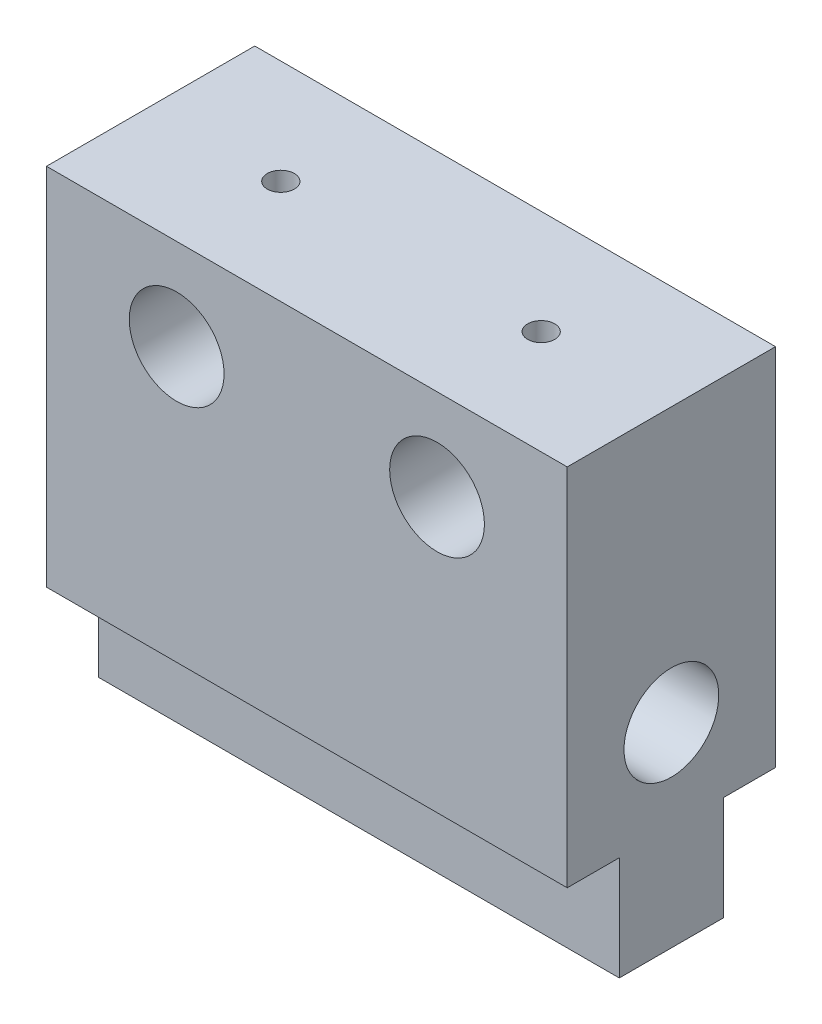
ISO-10303-21;
HEADER;
FILE_DESCRIPTION(('STEP AP214'),'2;1');
FILE_NAME('part.step','',(''),(''),'','','');
FILE_SCHEMA(('AUTOMOTIVE_DESIGN { 1 0 10303 214 1 1 1 1 }'));
ENDSEC;
DATA;
#1=APPLICATION_CONTEXT('core data for automotive mechanical design processes');
#2=APPLICATION_PROTOCOL_DEFINITION('international standard','automotive_design',2000,#1);
#3=PRODUCT_CONTEXT('',#1,'mechanical');
#4=PRODUCT('Part','Part','',(#3));
#5=PRODUCT_RELATED_PRODUCT_CATEGORY('part','',(#4));
#6=PRODUCT_DEFINITION_FORMATION('','',#4);
#7=PRODUCT_DEFINITION_CONTEXT('part definition',#1,'design');
#8=PRODUCT_DEFINITION('design','',#6,#7);
#9=PRODUCT_DEFINITION_SHAPE('','',#8);
#10=(LENGTH_UNIT() NAMED_UNIT(*) SI_UNIT(.MILLI.,.METRE.));
#11=(NAMED_UNIT(*) PLANE_ANGLE_UNIT() SI_UNIT($,.RADIAN.));
#12=(NAMED_UNIT(*) SI_UNIT($,.STERADIAN.) SOLID_ANGLE_UNIT());
#13=UNCERTAINTY_MEASURE_WITH_UNIT(LENGTH_MEASURE(1.E-05),#10,'distance_accuracy_value','');
#14=(GEOMETRIC_REPRESENTATION_CONTEXT(3) GLOBAL_UNCERTAINTY_ASSIGNED_CONTEXT((#13)) GLOBAL_UNIT_ASSIGNED_CONTEXT((#10,
#11,#12)) REPRESENTATION_CONTEXT('',''));
#15=CARTESIAN_POINT('',(0.,0.,0.));
#16=DIRECTION('',(0.,0.,1.));
#17=DIRECTION('',(1.,0.,0.));
#18=AXIS2_PLACEMENT_3D('',#15,#16,#17);
#19=CARTESIAN_POINT('',(-50.,-35.,20.));
#20=DIRECTION('',(0.,1.,0.));
#21=DIRECTION('',(0.,0.,1.));
#22=AXIS2_PLACEMENT_3D('',#19,#20,#21);
#23=PLANE('',#22);
#24=DIRECTION('',(1.,0.,0.));
#25=VECTOR('',#24,1.);
#26=CARTESIAN_POINT('',(-50.,-35.,-10.));
#27=LINE('',#26,#25);
#28=CARTESIAN_POINT('',(-50.,-35.,-10.));
#29=VERTEX_POINT('',#28);
#30=CARTESIAN_POINT('',(50.,-35.,-10.));
#31=VERTEX_POINT('',#30);
#32=EDGE_CURVE('E66',#29,#31,#27,.T.);
#33=ORIENTED_EDGE('',*,*,#32,.F.);
#34=DIRECTION('',(0.,0.,-1.));
#35=VECTOR('',#34,1.);
#36=CARTESIAN_POINT('',(-50.,-35.,20.));
#37=LINE('',#36,#35);
#38=CARTESIAN_POINT('',(-50.,-35.,-20.));
#39=VERTEX_POINT('',#38);
#40=EDGE_CURVE('E210',#29,#39,#37,.T.);
#41=ORIENTED_EDGE('',*,*,#40,.T.);
#42=DIRECTION('',(1.,0.,0.));
#43=VECTOR('',#42,1.);
#44=CARTESIAN_POINT('',(-50.,-35.,-20.));
#45=LINE('',#44,#43);
#46=CARTESIAN_POINT('',(50.,-35.,-20.));
#47=VERTEX_POINT('',#46);
#48=EDGE_CURVE('E188',#39,#47,#45,.T.);
#49=ORIENTED_EDGE('',*,*,#48,.T.);
#50=DIRECTION('',(0.,0.,-1.));
#51=VECTOR('',#50,1.);
#52=CARTESIAN_POINT('',(50.,-35.,20.));
#53=LINE('',#52,#51);
#54=EDGE_CURVE('E71',#31,#47,#53,.T.);
#55=ORIENTED_EDGE('',*,*,#54,.F.);
#56=EDGE_LOOP('',(#33,#41,#49,#55));
#57=FACE_BOUND('',#56,.T.);
#58=ADVANCED_FACE('F43',(#57),#23,.F.);
#59=DIRECTION('',(-1.,0.,0.));
#60=VECTOR('',#59,1.);
#61=CARTESIAN_POINT('',(-50.,-35.,10.));
#62=LINE('',#61,#60);
#63=CARTESIAN_POINT('',(50.,-35.,10.));
#64=VERTEX_POINT('',#63);
#65=CARTESIAN_POINT('',(-50.,-35.,10.));
#66=VERTEX_POINT('',#65);
#67=EDGE_CURVE('E437',#64,#66,#62,.T.);
#68=ORIENTED_EDGE('',*,*,#67,.F.);
#69=CARTESIAN_POINT('',(50.,-35.,20.));
#70=VERTEX_POINT('',#69);
#71=EDGE_CURVE('E141',#70,#64,#53,.T.);
#72=ORIENTED_EDGE('',*,*,#71,.F.);
#73=DIRECTION('',(1.,0.,0.));
#74=VECTOR('',#73,1.);
#75=CARTESIAN_POINT('',(-50.,-35.,20.));
#76=LINE('',#75,#74);
#77=CARTESIAN_POINT('',(-50.,-35.,20.));
#78=VERTEX_POINT('',#77);
#79=EDGE_CURVE('E194',#78,#70,#76,.T.);
#80=ORIENTED_EDGE('',*,*,#79,.F.);
#81=EDGE_CURVE('E211',#78,#66,#37,.T.);
#82=ORIENTED_EDGE('',*,*,#81,.T.);
#83=EDGE_LOOP('',(#68,#72,#80,#82));
#84=FACE_BOUND('',#83,.T.);
#85=ADVANCED_FACE('F245',(#84),#23,.F.);
#86=CARTESIAN_POINT('',(50.,-35.,20.));
#87=DIRECTION('',(-1.,0.,0.));
#88=DIRECTION('',(0.,0.,1.));
#89=AXIS2_PLACEMENT_3D('',#86,#87,#88);
#90=PLANE('',#89);
#91=CARTESIAN_POINT('',(50.,-17.5,0.));
#92=DIRECTION('',(-1.,0.,0.));
#93=DIRECTION('',(0.,0.,1.));
#94=AXIS2_PLACEMENT_3D('',#91,#92,#93);
#95=CIRCLE('',#94,9.1);
#96=CARTESIAN_POINT('',(50.,-17.5,9.1));
#97=VERTEX_POINT('',#96);
#98=EDGE_CURVE('E158',#97,#97,#95,.T.);
#99=ORIENTED_EDGE('',*,*,#98,.T.);
#100=EDGE_LOOP('',(#99));
#101=FACE_BOUND('',#100,.T.);
#102=DIRECTION('',(0.,1.,0.));
#103=VECTOR('',#102,1.);
#104=CARTESIAN_POINT('',(50.,-35.,-20.));
#105=LINE('',#104,#103);
#106=CARTESIAN_POINT('',(50.,35.,-20.));
#107=VERTEX_POINT('',#106);
#108=EDGE_CURVE('E182',#47,#107,#105,.T.);
#109=ORIENTED_EDGE('',*,*,#108,.T.);
#110=DIRECTION('',(0.,0.,-1.));
#111=VECTOR('',#110,1.);
#112=CARTESIAN_POINT('',(50.,35.,20.));
#113=LINE('',#112,#111);
#114=CARTESIAN_POINT('',(50.,35.,20.));
#115=VERTEX_POINT('',#114);
#116=EDGE_CURVE('E11',#115,#107,#113,.T.);
#117=ORIENTED_EDGE('',*,*,#116,.F.);
#118=DIRECTION('',(0.,1.,0.));
#119=VECTOR('',#118,1.);
#120=CARTESIAN_POINT('',(50.,-35.,20.));
#121=LINE('',#120,#119);
#122=EDGE_CURVE('E183',#70,#115,#121,.T.);
#123=ORIENTED_EDGE('',*,*,#122,.F.);
#124=ORIENTED_EDGE('',*,*,#71,.T.);
#125=DIRECTION('',(0.,1.,0.));
#126=VECTOR('',#125,1.);
#127=CARTESIAN_POINT('',(50.,-55.,10.));
#128=LINE('',#127,#126);
#129=CARTESIAN_POINT('',(50.,-55.,10.));
#130=VERTEX_POINT('',#129);
#131=EDGE_CURVE('E119',#130,#64,#128,.T.);
#132=ORIENTED_EDGE('',*,*,#131,.F.);
#133=DIRECTION('',(0.,0.,1.));
#134=VECTOR('',#133,1.);
#135=CARTESIAN_POINT('',(50.,-55.,-10.));
#136=LINE('',#135,#134);
#137=CARTESIAN_POINT('',(50.,-55.,-10.));
#138=VERTEX_POINT('',#137);
#139=EDGE_CURVE('E126',#138,#130,#136,.T.);
#140=ORIENTED_EDGE('',*,*,#139,.F.);
#141=DIRECTION('',(0.,1.,0.));
#142=VECTOR('',#141,1.);
#143=CARTESIAN_POINT('',(50.,-55.,-10.));
#144=LINE('',#143,#142);
#145=EDGE_CURVE('E428',#138,#31,#144,.T.);
#146=ORIENTED_EDGE('',*,*,#145,.T.);
#147=ORIENTED_EDGE('',*,*,#54,.T.);
#148=EDGE_LOOP('',(#109,#117,#123,#124,#132,#140,#146,#147));
#149=FACE_BOUND('',#148,.T.);
#150=ADVANCED_FACE('F45',(#101,#149),#90,.F.);
#151=CARTESIAN_POINT('',(-50.,35.,20.));
#152=DIRECTION('',(0.,-1.,0.));
#153=DIRECTION('',(0.,0.,-1.));
#154=AXIS2_PLACEMENT_3D('',#151,#152,#153);
#155=PLANE('',#154);
#156=CARTESIAN_POINT('',(-25.,35.,0.));
#157=DIRECTION('',(0.,1.,0.));
#158=DIRECTION('',(0.,0.,1.));
#159=AXIS2_PLACEMENT_3D('',#156,#157,#158);
#160=CIRCLE('',#159,2.6);
#161=CARTESIAN_POINT('',(-25.,35.,2.6));
#162=VERTEX_POINT('',#161);
#163=EDGE_CURVE('E148',#162,#162,#160,.T.);
#164=ORIENTED_EDGE('',*,*,#163,.F.);
#165=EDGE_LOOP('',(#164));
#166=FACE_BOUND('',#165,.T.);
#167=CARTESIAN_POINT('',(25.,35.,0.));
#168=DIRECTION('',(0.,1.,0.));
#169=DIRECTION('',(0.,0.,1.));
#170=AXIS2_PLACEMENT_3D('',#167,#168,#169);
#171=CIRCLE('',#170,2.6);
#172=CARTESIAN_POINT('',(25.,35.,2.6));
#173=VERTEX_POINT('',#172);
#174=EDGE_CURVE('E143',#173,#173,#171,.T.);
#175=ORIENTED_EDGE('',*,*,#174,.F.);
#176=EDGE_LOOP('',(#175));
#177=FACE_BOUND('',#176,.T.);
#178=DIRECTION('',(-1.,0.,0.));
#179=VECTOR('',#178,1.);
#180=CARTESIAN_POINT('',(-50.,35.,-20.));
#181=LINE('',#180,#179);
#182=CARTESIAN_POINT('',(-50.,35.,-20.));
#183=VERTEX_POINT('',#182);
#184=EDGE_CURVE('E199',#107,#183,#181,.T.);
#185=ORIENTED_EDGE('',*,*,#184,.T.);
#186=DIRECTION('',(0.,0.,-1.));
#187=VECTOR('',#186,1.);
#188=CARTESIAN_POINT('',(-50.,35.,20.));
#189=LINE('',#188,#187);
#190=CARTESIAN_POINT('',(-50.,35.,20.));
#191=VERTEX_POINT('',#190);
#192=EDGE_CURVE('E58',#191,#183,#189,.T.);
#193=ORIENTED_EDGE('',*,*,#192,.F.);
#194=DIRECTION('',(-1.,0.,0.));
#195=VECTOR('',#194,1.);
#196=CARTESIAN_POINT('',(-50.,35.,20.));
#197=LINE('',#196,#195);
#198=EDGE_CURVE('E187',#115,#191,#197,.T.);
#199=ORIENTED_EDGE('',*,*,#198,.F.);
#200=ORIENTED_EDGE('',*,*,#116,.T.);
#201=EDGE_LOOP('',(#185,#193,#199,#200));
#202=FACE_BOUND('',#201,.T.);
#203=ADVANCED_FACE('F259',(#166,#177,#202),#155,.F.);
#204=CARTESIAN_POINT('',(-50.,-35.,20.));
#205=DIRECTION('',(1.,0.,0.));
#206=DIRECTION('',(0.,0.,-1.));
#207=AXIS2_PLACEMENT_3D('',#204,#205,#206);
#208=PLANE('',#207);
#209=CARTESIAN_POINT('',(-50.,-17.5,0.));
#210=DIRECTION('',(-1.,0.,0.));
#211=DIRECTION('',(0.,0.,1.));
#212=AXIS2_PLACEMENT_3D('',#209,#210,#211);
#213=CIRCLE('',#212,9.1);
#214=CARTESIAN_POINT('',(-50.,-17.5,9.1));
#215=VERTEX_POINT('',#214);
#216=EDGE_CURVE('E163',#215,#215,#213,.T.);
#217=ORIENTED_EDGE('',*,*,#216,.F.);
#218=EDGE_LOOP('',(#217));
#219=FACE_BOUND('',#218,.T.);
#220=DIRECTION('',(0.,-1.,0.));
#221=VECTOR('',#220,1.);
#222=CARTESIAN_POINT('',(-50.,-35.,-20.));
#223=LINE('',#222,#221);
#224=EDGE_CURVE('E202',#183,#39,#223,.T.);
#225=ORIENTED_EDGE('',*,*,#224,.T.);
#226=ORIENTED_EDGE('',*,*,#40,.F.);
#227=DIRECTION('',(0.,1.,0.));
#228=VECTOR('',#227,1.);
#229=CARTESIAN_POINT('',(-50.,-55.,-10.));
#230=LINE('',#229,#228);
#231=CARTESIAN_POINT('',(-50.,-55.,-10.));
#232=VERTEX_POINT('',#231);
#233=EDGE_CURVE('E150',#232,#29,#230,.T.);
#234=ORIENTED_EDGE('',*,*,#233,.F.);
#235=DIRECTION('',(0.,0.,-1.));
#236=VECTOR('',#235,1.);
#237=CARTESIAN_POINT('',(-50.,-55.,-10.));
#238=LINE('',#237,#236);
#239=CARTESIAN_POINT('',(-50.,-55.,10.));
#240=VERTEX_POINT('',#239);
#241=EDGE_CURVE('E125',#240,#232,#238,.T.);
#242=ORIENTED_EDGE('',*,*,#241,.F.);
#243=DIRECTION('',(0.,1.,0.));
#244=VECTOR('',#243,1.);
#245=CARTESIAN_POINT('',(-50.,-55.,10.));
#246=LINE('',#245,#244);
#247=EDGE_CURVE('E121',#240,#66,#246,.T.);
#248=ORIENTED_EDGE('',*,*,#247,.T.);
#249=ORIENTED_EDGE('',*,*,#81,.F.);
#250=DIRECTION('',(0.,-1.,0.));
#251=VECTOR('',#250,1.);
#252=CARTESIAN_POINT('',(-50.,-35.,20.));
#253=LINE('',#252,#251);
#254=EDGE_CURVE('E191',#191,#78,#253,.T.);
#255=ORIENTED_EDGE('',*,*,#254,.F.);
#256=ORIENTED_EDGE('',*,*,#192,.T.);
#257=EDGE_LOOP('',(#225,#226,#234,#242,#248,#249,#255,#256));
#258=FACE_BOUND('',#257,.T.);
#259=ADVANCED_FACE('F256',(#219,#258),#208,.F.);
#260=CARTESIAN_POINT('',(0.,0.,20.));
#261=DIRECTION('',(0.,0.,-1.));
#262=DIRECTION('',(-1.,0.,0.));
#263=AXIS2_PLACEMENT_3D('',#260,#261,#262);
#264=PLANE('',#263);
#265=CARTESIAN_POINT('',(25.,17.5,20.));
#266=DIRECTION('',(0.,0.,-1.));
#267=DIRECTION('',(-1.,0.,0.));
#268=AXIS2_PLACEMENT_3D('',#265,#266,#267);
#269=CIRCLE('',#268,9.1);
#270=CARTESIAN_POINT('',(15.9,17.5,20.));
#271=VERTEX_POINT('',#270);
#272=EDGE_CURVE('E178',#271,#271,#269,.T.);
#273=ORIENTED_EDGE('',*,*,#272,.T.);
#274=EDGE_LOOP('',(#273));
#275=FACE_BOUND('',#274,.T.);
#276=CARTESIAN_POINT('',(-25.,17.5,20.));
#277=DIRECTION('',(0.,0.,-1.));
#278=DIRECTION('',(-1.,0.,0.));
#279=AXIS2_PLACEMENT_3D('',#276,#277,#278);
#280=CIRCLE('',#279,9.1);
#281=CARTESIAN_POINT('',(-34.1,17.5,20.));
#282=VERTEX_POINT('',#281);
#283=EDGE_CURVE('E171',#282,#282,#280,.T.);
#284=ORIENTED_EDGE('',*,*,#283,.T.);
#285=EDGE_LOOP('',(#284));
#286=FACE_BOUND('',#285,.T.);
#287=ORIENTED_EDGE('',*,*,#122,.T.);
#288=ORIENTED_EDGE('',*,*,#198,.T.);
#289=ORIENTED_EDGE('',*,*,#254,.T.);
#290=ORIENTED_EDGE('',*,*,#79,.T.);
#291=EDGE_LOOP('',(#287,#288,#289,#290));
#292=FACE_BOUND('',#291,.T.);
#293=ADVANCED_FACE('F258',(#275,#286,#292),#264,.F.);
#294=CARTESIAN_POINT('',(0.,0.,-20.));
#295=DIRECTION('',(0.,0.,-1.));
#296=DIRECTION('',(-1.,0.,0.));
#297=AXIS2_PLACEMENT_3D('',#294,#295,#296);
#298=PLANE('',#297);
#299=CARTESIAN_POINT('',(25.,17.5,-20.));
#300=DIRECTION('',(0.,0.,1.));
#301=DIRECTION('',(1.,0.,0.));
#302=AXIS2_PLACEMENT_3D('',#299,#300,#301);
#303=CIRCLE('',#302,9.1);
#304=CARTESIAN_POINT('',(34.1,17.5,-20.));
#305=VERTEX_POINT('',#304);
#306=EDGE_CURVE('E167',#305,#305,#303,.T.);
#307=ORIENTED_EDGE('',*,*,#306,.T.);
#308=EDGE_LOOP('',(#307));
#309=FACE_BOUND('',#308,.T.);
#310=CARTESIAN_POINT('',(-25.,17.5,-20.));
#311=DIRECTION('',(0.,0.,1.));
#312=DIRECTION('',(1.,0.,0.));
#313=AXIS2_PLACEMENT_3D('',#310,#311,#312);
#314=CIRCLE('',#313,9.1);
#315=CARTESIAN_POINT('',(-15.9,17.5,-20.));
#316=VERTEX_POINT('',#315);
#317=EDGE_CURVE('E162',#316,#316,#314,.T.);
#318=ORIENTED_EDGE('',*,*,#317,.T.);
#319=EDGE_LOOP('',(#318));
#320=FACE_BOUND('',#319,.T.);
#321=ORIENTED_EDGE('',*,*,#108,.F.);
#322=ORIENTED_EDGE('',*,*,#48,.F.);
#323=ORIENTED_EDGE('',*,*,#224,.F.);
#324=ORIENTED_EDGE('',*,*,#184,.F.);
#325=EDGE_LOOP('',(#321,#322,#323,#324));
#326=FACE_BOUND('',#325,.T.);
#327=ADVANCED_FACE('F254',(#309,#320,#326),#298,.T.);
#328=CARTESIAN_POINT('',(-25.,17.5,-20.));
#329=DIRECTION('',(0.,0.,1.));
#330=DIRECTION('',(1.,0.,0.));
#331=AXIS2_PLACEMENT_3D('',#328,#329,#330);
#332=CYLINDRICAL_SURFACE('',#331,9.1);
#333=CARTESIAN_POINT('',(-25.,26.6,2.6));
#334=CARTESIAN_POINT('',(-24.8570586269096,26.5999983008264,2.59999747856947));
#335=CARTESIAN_POINT('',(-24.7140913277657,26.5965994262266,2.58817287433105));
#336=CARTESIAN_POINT('',(-24.4323004114439,26.5833717772863,2.54128644886699));
#337=CARTESIAN_POINT('',(-24.2934783831215,26.5735405697311,2.50621583410368));
#338=CARTESIAN_POINT('',(-24.0240844090408,26.5485289875379,2.41408955005854));
#339=CARTESIAN_POINT('',(-23.8935012548973,26.5333560733824,2.35706453300247));
#340=CARTESIAN_POINT('',(-23.643750610532,26.4992497181151,2.22276861107814));
#341=CARTESIAN_POINT('',(-23.5245843164684,26.4803158836043,2.14549558796254));
#342=CARTESIAN_POINT('',(-23.2979172190834,26.4401615501325,1.97075448612521));
#343=CARTESIAN_POINT('',(-23.1907591609048,26.4188975452875,1.87285181998815));
#344=CARTESIAN_POINT('',(-22.9941372346984,26.3767475539033,1.66055793392101));
#345=CARTESIAN_POINT('',(-22.9046760197988,26.3558616244715,1.5461642460781));
#346=CARTESIAN_POINT('',(-22.7442427299164,26.31637919338,1.30130834237181));
#347=CARTESIAN_POINT('',(-22.6736783256565,26.2978371325782,1.17056941941568));
#348=CARTESIAN_POINT('',(-22.5556727827983,26.2657874699287,0.898466384724004));
#349=CARTESIAN_POINT('',(-22.5082266697757,26.2522787851833,0.757104566307838));
#350=CARTESIAN_POINT('',(-22.4390203708196,26.2322769065482,0.471594807884798));
#351=CARTESIAN_POINT('',(-22.416632808363,26.2256127214101,0.327611228401811));
#352=CARTESIAN_POINT('',(-22.3962213187406,26.2195447066259,0.0377895070200661));
#353=CARTESIAN_POINT('',(-22.3981920976749,26.220139299399,-0.10804822502529));
#354=CARTESIAN_POINT('',(-22.4259462480823,26.2283694473291,-0.392429194893011));
#355=CARTESIAN_POINT('',(-22.4509557655309,26.2357761750732,-0.531055656534988));
#356=CARTESIAN_POINT('',(-22.5228319808847,26.2564275289765,-0.802057385515875));
#357=CARTESIAN_POINT('',(-22.5697006547438,26.2696726828932,-0.934432086536653));
#358=CARTESIAN_POINT('',(-22.6845611452085,26.300699225709,-1.19112011776136));
#359=CARTESIAN_POINT('',(-22.7528128347526,26.3185359132734,-1.31531019412218));
#360=CARTESIAN_POINT('',(-22.9083210708175,26.3567078194668,-1.55073952957743));
#361=CARTESIAN_POINT('',(-22.9955818482465,26.3770435938849,-1.66197589705539));
#362=CARTESIAN_POINT('',(-23.1905248042507,26.4188612585326,-1.87274408828828));
#363=CARTESIAN_POINT('',(-23.2988526627011,26.4403574594408,-1.9716768187574));
#364=CARTESIAN_POINT('',(-23.5308280328979,26.4813912138385,-2.15010380473237));
#365=CARTESIAN_POINT('',(-23.6544763380736,26.5009286657917,-2.22959705285423));
#366=CARTESIAN_POINT('',(-23.9146000049811,26.5359948648515,-2.36720735520625));
#367=CARTESIAN_POINT('',(-24.051143236847,26.551500581464,-2.42520237284544));
#368=CARTESIAN_POINT('',(-24.3325888010423,26.5765902693386,-2.51723405884187));
#369=CARTESIAN_POINT('',(-24.4774890164468,26.5861757331313,-2.55127676601885));
#370=CARTESIAN_POINT('',(-24.7664336947624,26.5981133686907,-2.59346527142229));
#371=CARTESIAN_POINT('',(-24.9103502490814,26.6006925470578,-2.60242410398493));
#372=CARTESIAN_POINT('',(-25.1976344848473,26.5989871011922,-2.59645455380865));
#373=CARTESIAN_POINT('',(-25.3410022300842,26.5947033005482,-2.5815290373003));
#374=CARTESIAN_POINT('',(-25.6201242234594,26.5799010469077,-2.52887642238887));
#375=CARTESIAN_POINT('',(-25.7559736752553,26.5695099692298,-2.49161486427959));
#376=CARTESIAN_POINT('',(-26.0194712920673,26.5436839836445,-2.39589934741992));
#377=CARTESIAN_POINT('',(-26.1471185066233,26.5282484924565,-2.33744293784387));
#378=CARTESIAN_POINT('',(-26.3936541906561,26.4935294951988,-2.19956966236133));
#379=CARTESIAN_POINT('',(-26.5122932325021,26.4741699213179,-2.11972644152706));
#380=CARTESIAN_POINT('',(-26.7347700864773,26.4338333122802,-1.94187174226358));
#381=CARTESIAN_POINT('',(-26.838604522096,26.4128559098183,-1.84385613091609));
#382=CARTESIAN_POINT('',(-27.0320383568421,26.3707920551808,-1.62862785533569));
#383=CARTESIAN_POINT('',(-27.1210610556292,26.3497244791505,-1.5108921417731));
#384=CARTESIAN_POINT('',(-27.2781139108879,26.3106056315597,-1.26169863478807));
#385=CARTESIAN_POINT('',(-27.3461447977329,26.2925542550656,-1.13024131899787));
#386=CARTESIAN_POINT('',(-27.4587869035375,26.2617224661293,-0.857881425731707));
#387=CARTESIAN_POINT('',(-27.5035222321149,26.2489142002799,-0.717033507451198));
#388=CARTESIAN_POINT('',(-27.5685328508829,26.2300519368065,-0.429377083754667));
#389=CARTESIAN_POINT('',(-27.5888155527228,26.2239958926099,-0.282570398407748));
#390=CARTESIAN_POINT('',(-27.6038743152075,26.2195121402902,0.0068848428353685));
#391=CARTESIAN_POINT('',(-27.5995843593688,26.2208050891539,0.149481155970233));
#392=CARTESIAN_POINT('',(-27.5678212424392,26.2302097623325,0.431827149901222));
#393=CARTESIAN_POINT('',(-27.540348854938,26.2383212591148,0.571576925525959));
#394=CARTESIAN_POINT('',(-27.4635775946199,26.2602707034421,0.842891882503012));
#395=CARTESIAN_POINT('',(-27.4145041932236,26.274049401732,0.974526003110185));
#396=CARTESIAN_POINT('',(-27.2960983409197,26.3057749368521,1.22779635484419));
#397=CARTESIAN_POINT('',(-27.2267623045608,26.3237225112452,1.34943081165638));
#398=CARTESIAN_POINT('',(-27.067085104953,26.3625116963759,1.58363857834571));
#399=CARTESIAN_POINT('',(-26.9761199603956,26.383429921335,1.69577380874422));
#400=CARTESIAN_POINT('',(-26.7769177924931,26.4254079861918,1.90349106455309));
#401=CARTESIAN_POINT('',(-26.6686764259471,26.4464678604212,1.99906891484412));
#402=CARTESIAN_POINT('',(-26.434646617125,26.4870034744427,2.17338833962452));
#403=CARTESIAN_POINT('',(-26.3084792530677,26.5064247134869,2.25163508345049));
#404=CARTESIAN_POINT('',(-26.0442256885407,26.5408681451131,2.38568952052863));
#405=CARTESIAN_POINT('',(-25.9061460513492,26.5558927403136,2.44150947551299));
#406=CARTESIAN_POINT('',(-25.6407912099355,26.5782554814291,2.52310181681408));
#407=CARTESIAN_POINT('',(-25.5144919099117,26.586345896707,2.55186559768993));
#408=CARTESIAN_POINT('',(-25.2588018794223,26.5972185700779,2.59031455441478));
#409=CARTESIAN_POINT('',(-25.1294115649009,26.6000015383419,2.60000228276995));
#410=CARTESIAN_POINT('',(-25.,26.6,2.6));
#411=B_SPLINE_CURVE_WITH_KNOTS('',3,(#333,#334,#335,#336,#337,#338,#339,#340,#341,#342,#343,
#344,#345,#346,#347,#348,#349,#350,#351,#352,#353,#354,#355,#356,#357,#358,#359,#360,#361,#362,
#363,#364,#365,#366,#367,#368,#369,#370,#371,#372,#373,#374,#375,#376,#377,#378,#379,#380,#381,
#382,#383,#384,#385,#386,#387,#388,#389,#390,#391,#392,#393,#394,#395,#396,#397,#398,#399,#400,
#401,#402,#403,#404,#405,#406,#407,#408,#409,#410),.UNSPECIFIED.,.T.,.F.,(4,2,2,2,2,2,2,2,2,2,2,
2,2,2,2,2,2,2,2,2,2,2,2,2,2,2,2,2,2,2,2,2,2,2,2,2,2,2,4),(0.,0.428349106305046,
0.856860341733736,1.28477545676395,1.71273535606571,2.15082154990016,2.58897337235828,
3.03592997890074,3.48279037008252,3.91819362821575,4.35350226000603,4.77470221578133,
5.19594025321964,5.62251044278573,6.04917567250546,6.49192050783252,6.93468828202084,
7.37993231435783,7.82506405218996,8.25559095007661,8.68606618665043,9.10786682623375,
9.52971625548188,9.96069782947787,10.3917775414412,10.8369573634963,11.2821216945489,
11.7248894537598,12.1675229752405,12.5934468610464,13.0193565344808,13.4409222518495,
13.8625626100315,14.2982795396378,14.7341061804732,15.1811137266752,15.6278765401062,
16.0157330845563,16.4035377276234),.UNSPECIFIED.);
#412=CARTESIAN_POINT('',(-25.,26.6,2.6));
#413=VERTEX_POINT('',#412);
#414=EDGE_CURVE('E47',#413,#413,#411,.T.);
#415=ORIENTED_EDGE('',*,*,#414,.T.);
#416=EDGE_LOOP('',(#415));
#417=FACE_BOUND('',#416,.T.);
#418=ORIENTED_EDGE('',*,*,#317,.F.);
#419=EDGE_LOOP('',(#418));
#420=FACE_BOUND('',#419,.T.);
#421=ORIENTED_EDGE('',*,*,#283,.F.);
#422=EDGE_LOOP('',(#421));
#423=FACE_BOUND('',#422,.T.);
#424=ADVANCED_FACE('F240',(#417,#420,#423),#332,.F.);
#425=CARTESIAN_POINT('',(25.,17.5,-20.));
#426=DIRECTION('',(0.,0.,1.));
#427=DIRECTION('',(1.,0.,0.));
#428=AXIS2_PLACEMENT_3D('',#425,#426,#427);
#429=CYLINDRICAL_SURFACE('',#428,9.1);
#430=CARTESIAN_POINT('',(25.,26.6,2.6));
#431=CARTESIAN_POINT('',(25.1429413730904,26.5999983008264,2.59999747856947));
#432=CARTESIAN_POINT('',(25.2859086722343,26.5965994262266,2.58817287433105));
#433=CARTESIAN_POINT('',(25.5676995885561,26.5833717772863,2.54128644886699));
#434=CARTESIAN_POINT('',(25.7065216168785,26.5735405697311,2.50621583410368));
#435=CARTESIAN_POINT('',(25.9759155909592,26.548528987538,2.41408955005854));
#436=CARTESIAN_POINT('',(26.1064987451027,26.5333560733824,2.35706453300247));
#437=CARTESIAN_POINT('',(26.356249389468,26.4992497181151,2.22276861107814));
#438=CARTESIAN_POINT('',(26.4754156835316,26.4803158836043,2.14549558796254));
#439=CARTESIAN_POINT('',(26.7020827809166,26.4401615501325,1.97075448612521));
#440=CARTESIAN_POINT('',(26.8092408390952,26.4188975452875,1.87285181998815));
#441=CARTESIAN_POINT('',(27.0058627653016,26.3767475539033,1.66055793392101));
#442=CARTESIAN_POINT('',(27.0953239802012,26.3558616244715,1.5461642460781));
#443=CARTESIAN_POINT('',(27.2557572700836,26.31637919338,1.30130834237181));
#444=CARTESIAN_POINT('',(27.3263216743435,26.2978371325782,1.17056941941568));
#445=CARTESIAN_POINT('',(27.4443272172017,26.2657874699287,0.898466384724007));
#446=CARTESIAN_POINT('',(27.4917733302243,26.2522787851833,0.757104566307841));
#447=CARTESIAN_POINT('',(27.5609796291804,26.2322769065482,0.471594807884799));
#448=CARTESIAN_POINT('',(27.583367191637,26.2256127214102,0.327611228401813));
#449=CARTESIAN_POINT('',(27.6037786812594,26.2195447066259,0.0377895070200684));
#450=CARTESIAN_POINT('',(27.6018079023251,26.220139299399,-0.108048225025288));
#451=CARTESIAN_POINT('',(27.5740537519177,26.2283694473291,-0.392429194893009));
#452=CARTESIAN_POINT('',(27.5490442344691,26.2357761750732,-0.531055656534986));
#453=CARTESIAN_POINT('',(27.4771680191153,26.2564275289765,-0.802057385515874));
#454=CARTESIAN_POINT('',(27.4302993452562,26.2696726828933,-0.934432086536652));
#455=CARTESIAN_POINT('',(27.3154388547915,26.300699225709,-1.19112011776136));
#456=CARTESIAN_POINT('',(27.2471871652474,26.3185359132734,-1.31531019412218));
#457=CARTESIAN_POINT('',(27.0916789291825,26.3567078194668,-1.55073952957743));
#458=CARTESIAN_POINT('',(27.0044181517535,26.3770435938849,-1.66197589705539));
#459=CARTESIAN_POINT('',(26.8094751957493,26.4188612585326,-1.87274408828828));
#460=CARTESIAN_POINT('',(26.7011473372989,26.4403574594408,-1.9716768187574));
#461=CARTESIAN_POINT('',(26.4691719671021,26.4813912138385,-2.15010380473237));
#462=CARTESIAN_POINT('',(26.3455236619265,26.5009286657917,-2.22959705285423));
#463=CARTESIAN_POINT('',(26.0853999950189,26.5359948648515,-2.36720735520625));
#464=CARTESIAN_POINT('',(25.948856763153,26.551500581464,-2.42520237284544));
#465=CARTESIAN_POINT('',(25.6674111989577,26.5765902693386,-2.51723405884187));
#466=CARTESIAN_POINT('',(25.5225109835532,26.5861757331313,-2.55127676601885));
#467=CARTESIAN_POINT('',(25.2335663052377,26.5981133686907,-2.59346527142229));
#468=CARTESIAN_POINT('',(25.0896497509187,26.6006925470578,-2.60242410398493));
#469=CARTESIAN_POINT('',(24.8023655151527,26.5989871011922,-2.59645455380864));
#470=CARTESIAN_POINT('',(24.6589977699158,26.5947033005482,-2.5815290373003));
#471=CARTESIAN_POINT('',(24.3798757765406,26.5799010469077,-2.52887642238887));
#472=CARTESIAN_POINT('',(24.2440263247447,26.5695099692298,-2.49161486427959));
#473=CARTESIAN_POINT('',(23.9805287079327,26.5436839836445,-2.39589934741992));
#474=CARTESIAN_POINT('',(23.8528814933767,26.5282484924565,-2.33744293784387));
#475=CARTESIAN_POINT('',(23.6063458093439,26.4935294951988,-2.19956966236133));
#476=CARTESIAN_POINT('',(23.4877067674979,26.4741699213179,-2.11972644152706));
#477=CARTESIAN_POINT('',(23.2652299135227,26.4338333122802,-1.94187174226358));
#478=CARTESIAN_POINT('',(23.161395477904,26.4128559098183,-1.84385613091609));
#479=CARTESIAN_POINT('',(22.9679616431579,26.3707920551808,-1.62862785533569));
#480=CARTESIAN_POINT('',(22.8789389443708,26.3497244791505,-1.5108921417731));
#481=CARTESIAN_POINT('',(22.7218860891121,26.3106056315597,-1.26169863478807));
#482=CARTESIAN_POINT('',(22.6538552022671,26.2925542550657,-1.13024131899787));
#483=CARTESIAN_POINT('',(22.5412130964625,26.2617224661293,-0.857881425731711));
#484=CARTESIAN_POINT('',(22.4964777678851,26.2489142002799,-0.717033507451201));
#485=CARTESIAN_POINT('',(22.4314671491171,26.2300519368065,-0.429377083754669));
#486=CARTESIAN_POINT('',(22.4111844472772,26.2239958926099,-0.282570398407749));
#487=CARTESIAN_POINT('',(22.3961256847925,26.2195121402902,0.00688484283536731));
#488=CARTESIAN_POINT('',(22.4004156406312,26.2208050891539,0.149481155970231));
#489=CARTESIAN_POINT('',(22.4321787575608,26.2302097623325,0.431827149901221));
#490=CARTESIAN_POINT('',(22.459651145062,26.2383212591148,0.571576925525958));
#491=CARTESIAN_POINT('',(22.5364224053801,26.2602707034421,0.842891882503012));
#492=CARTESIAN_POINT('',(22.5854958067764,26.274049401732,0.974526003110186));
#493=CARTESIAN_POINT('',(22.7039016590803,26.3057749368521,1.2277963548442));
#494=CARTESIAN_POINT('',(22.7732376954392,26.3237225112452,1.34943081165638));
#495=CARTESIAN_POINT('',(22.932914895047,26.3625116963759,1.58363857834571));
#496=CARTESIAN_POINT('',(23.0238800396044,26.383429921335,1.69577380874422));
#497=CARTESIAN_POINT('',(23.2230822075069,26.4254079861918,1.90349106455309));
#498=CARTESIAN_POINT('',(23.3313235740529,26.4464678604212,1.99906891484412));
#499=CARTESIAN_POINT('',(23.565353382875,26.4870034744427,2.17338833962452));
#500=CARTESIAN_POINT('',(23.6915207469323,26.5064247134869,2.25163508345049));
#501=CARTESIAN_POINT('',(23.9557743114593,26.5408681451131,2.38568952052863));
#502=CARTESIAN_POINT('',(24.0938539486508,26.5558927403136,2.44150947551299));
#503=CARTESIAN_POINT('',(24.3592087900645,26.5782554814291,2.52310181681408));
#504=CARTESIAN_POINT('',(24.4855080900883,26.586345896707,2.55186559768993));
#505=CARTESIAN_POINT('',(24.7411981205777,26.5972185700779,2.59031455441478));
#506=CARTESIAN_POINT('',(24.8705884350991,26.6000015383419,2.60000228276995));
#507=CARTESIAN_POINT('',(25.,26.6,2.6));
#508=B_SPLINE_CURVE_WITH_KNOTS('',3,(#430,#431,#432,#433,#434,#435,#436,#437,#438,#439,#440,
#441,#442,#443,#444,#445,#446,#447,#448,#449,#450,#451,#452,#453,#454,#455,#456,#457,#458,#459,
#460,#461,#462,#463,#464,#465,#466,#467,#468,#469,#470,#471,#472,#473,#474,#475,#476,#477,#478,
#479,#480,#481,#482,#483,#484,#485,#486,#487,#488,#489,#490,#491,#492,#493,#494,#495,#496,#497,
#498,#499,#500,#501,#502,#503,#504,#505,#506,#507),.UNSPECIFIED.,.T.,.F.,(4,2,2,2,2,2,2,2,2,2,2,
2,2,2,2,2,2,2,2,2,2,2,2,2,2,2,2,2,2,2,2,2,2,2,2,2,2,2,4),(0.,0.428349106305046,
0.856860341733735,1.28477545676395,1.71273535606571,2.15082154990016,2.58897337235828,
3.03592997890074,3.48279037008252,3.91819362821574,4.35350226000603,4.77470221578133,
5.19594025321964,5.62251044278573,6.04917567250546,6.49192050783252,6.93468828202084,
7.37993231435783,7.82506405218996,8.2555909500766,8.68606618665043,9.10786682623375,
9.52971625548188,9.96069782947787,10.3917775414412,10.8369573634963,11.2821216945489,
11.7248894537598,12.1675229752405,12.5934468610464,13.0193565344808,13.4409222518495,
13.8625626100315,14.2982795396378,14.7341061804732,15.1811137266752,15.6278765401062,
16.0157330845563,16.4035377276234),.UNSPECIFIED.);
#509=CARTESIAN_POINT('',(25.,26.6,2.6));
#510=VERTEX_POINT('',#509);
#511=EDGE_CURVE('E156',#510,#510,#508,.T.);
#512=ORIENTED_EDGE('',*,*,#511,.T.);
#513=EDGE_LOOP('',(#512));
#514=FACE_BOUND('',#513,.T.);
#515=ORIENTED_EDGE('',*,*,#306,.F.);
#516=EDGE_LOOP('',(#515));
#517=FACE_BOUND('',#516,.T.);
#518=ORIENTED_EDGE('',*,*,#272,.F.);
#519=EDGE_LOOP('',(#518));
#520=FACE_BOUND('',#519,.T.);
#521=ADVANCED_FACE('F223',(#514,#517,#520),#429,.F.);
#522=CARTESIAN_POINT('',(50.,-17.5,0.));
#523=DIRECTION('',(-1.,0.,0.));
#524=DIRECTION('',(0.,0.,1.));
#525=AXIS2_PLACEMENT_3D('',#522,#523,#524);
#526=CYLINDRICAL_SURFACE('',#525,9.1);
#527=ORIENTED_EDGE('',*,*,#98,.F.);
#528=EDGE_LOOP('',(#527));
#529=FACE_BOUND('',#528,.T.);
#530=ORIENTED_EDGE('',*,*,#216,.T.);
#531=EDGE_LOOP('',(#530));
#532=FACE_BOUND('',#531,.T.);
#533=ADVANCED_FACE('F230',(#529,#532),#526,.F.);
#534=CARTESIAN_POINT('',(25.,15.,0.));
#535=DIRECTION('',(0.,1.,0.));
#536=DIRECTION('',(0.,0.,1.));
#537=AXIS2_PLACEMENT_3D('',#534,#535,#536);
#538=CYLINDRICAL_SURFACE('',#537,2.6);
#539=ORIENTED_EDGE('',*,*,#174,.T.);
#540=EDGE_LOOP('',(#539));
#541=FACE_BOUND('',#540,.T.);
#542=ORIENTED_EDGE('',*,*,#511,.F.);
#543=EDGE_LOOP('',(#542));
#544=FACE_BOUND('',#543,.T.);
#545=ADVANCED_FACE('F226',(#541,#544),#538,.F.);
#546=CARTESIAN_POINT('',(-25.,15.,0.));
#547=DIRECTION('',(0.,1.,0.));
#548=DIRECTION('',(0.,0.,1.));
#549=AXIS2_PLACEMENT_3D('',#546,#547,#548);
#550=CYLINDRICAL_SURFACE('',#549,2.6);
#551=ORIENTED_EDGE('',*,*,#163,.T.);
#552=EDGE_LOOP('',(#551));
#553=FACE_BOUND('',#552,.T.);
#554=ORIENTED_EDGE('',*,*,#414,.F.);
#555=EDGE_LOOP('',(#554));
#556=FACE_BOUND('',#555,.T.);
#557=ADVANCED_FACE('F229',(#553,#556),#550,.F.);
#558=CARTESIAN_POINT('',(-50.,-55.,10.));
#559=DIRECTION('',(0.,0.,-1.));
#560=DIRECTION('',(-1.,0.,0.));
#561=AXIS2_PLACEMENT_3D('',#558,#559,#560);
#562=PLANE('',#561);
#563=ORIENTED_EDGE('',*,*,#67,.T.);
#564=ORIENTED_EDGE('',*,*,#247,.F.);
#565=DIRECTION('',(-1.,0.,0.));
#566=VECTOR('',#565,1.);
#567=CARTESIAN_POINT('',(-50.,-55.,10.));
#568=LINE('',#567,#566);
#569=EDGE_CURVE('E114',#130,#240,#568,.T.);
#570=ORIENTED_EDGE('',*,*,#569,.F.);
#571=ORIENTED_EDGE('',*,*,#131,.T.);
#572=EDGE_LOOP('',(#563,#564,#570,#571));
#573=FACE_BOUND('',#572,.T.);
#574=ADVANCED_FACE('F117',(#573),#562,.F.);
#575=CARTESIAN_POINT('',(-50.,-55.,-10.));
#576=DIRECTION('',(0.,0.,1.));
#577=DIRECTION('',(1.,0.,0.));
#578=AXIS2_PLACEMENT_3D('',#575,#576,#577);
#579=PLANE('',#578);
#580=ORIENTED_EDGE('',*,*,#32,.T.);
#581=ORIENTED_EDGE('',*,*,#145,.F.);
#582=DIRECTION('',(1.,0.,0.));
#583=VECTOR('',#582,1.);
#584=CARTESIAN_POINT('',(-50.,-55.,-10.));
#585=LINE('',#584,#583);
#586=EDGE_CURVE('E131',#232,#138,#585,.T.);
#587=ORIENTED_EDGE('',*,*,#586,.F.);
#588=ORIENTED_EDGE('',*,*,#233,.T.);
#589=EDGE_LOOP('',(#580,#581,#587,#588));
#590=FACE_BOUND('',#589,.T.);
#591=ADVANCED_FACE('F296',(#590),#579,.F.);
#592=CARTESIAN_POINT('',(0.,-55.,0.));
#593=DIRECTION('',(0.,1.,0.));
#594=DIRECTION('',(0.,0.,1.));
#595=AXIS2_PLACEMENT_3D('',#592,#593,#594);
#596=PLANE('',#595);
#597=ORIENTED_EDGE('',*,*,#139,.T.);
#598=ORIENTED_EDGE('',*,*,#569,.T.);
#599=ORIENTED_EDGE('',*,*,#241,.T.);
#600=ORIENTED_EDGE('',*,*,#586,.T.);
#601=EDGE_LOOP('',(#597,#598,#599,#600));
#602=FACE_BOUND('',#601,.T.);
#603=ADVANCED_FACE('F129',(#602),#596,.F.);
#604=CLOSED_SHELL('',(#58,#85,#150,#203,#259,#293,#327,#424,#521,#533,#545,#557,#574,#591,#603));
#605=MANIFOLD_SOLID_BREP('B2',#604);
#606=ADVANCED_BREP_SHAPE_REPRESENTATION('',(#18,#605),#14);
#607=SHAPE_DEFINITION_REPRESENTATION(#9,#606);
ENDSEC;
END-ISO-10303-21;
